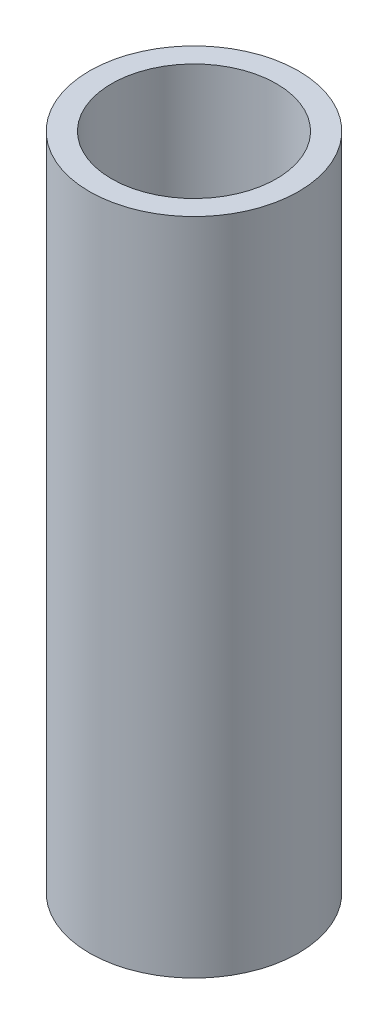
ISO-10303-21;
HEADER;
FILE_DESCRIPTION(('STEP AP214'),'2;1');
FILE_NAME('part.step','',(''),(''),'','','');
FILE_SCHEMA(('AUTOMOTIVE_DESIGN { 1 0 10303 214 1 1 1 1 }'));
ENDSEC;
DATA;
#1=APPLICATION_CONTEXT('core data for automotive mechanical design processes');
#2=APPLICATION_PROTOCOL_DEFINITION('international standard','automotive_design',2000,#1);
#3=PRODUCT_CONTEXT('',#1,'mechanical');
#4=PRODUCT('Part','Part','',(#3));
#5=PRODUCT_RELATED_PRODUCT_CATEGORY('part','',(#4));
#6=PRODUCT_DEFINITION_FORMATION('','',#4);
#7=PRODUCT_DEFINITION_CONTEXT('part definition',#1,'design');
#8=PRODUCT_DEFINITION('design','',#6,#7);
#9=PRODUCT_DEFINITION_SHAPE('','',#8);
#10=(LENGTH_UNIT() NAMED_UNIT(*) SI_UNIT(.MILLI.,.METRE.));
#11=(NAMED_UNIT(*) PLANE_ANGLE_UNIT() SI_UNIT($,.RADIAN.));
#12=(NAMED_UNIT(*) SI_UNIT($,.STERADIAN.) SOLID_ANGLE_UNIT());
#13=UNCERTAINTY_MEASURE_WITH_UNIT(LENGTH_MEASURE(1.E-05),#10,'distance_accuracy_value','');
#14=(GEOMETRIC_REPRESENTATION_CONTEXT(3) GLOBAL_UNCERTAINTY_ASSIGNED_CONTEXT((#13)) GLOBAL_UNIT_ASSIGNED_CONTEXT((#10,
#11,#12)) REPRESENTATION_CONTEXT('',''));
#15=CARTESIAN_POINT('',(0.,0.,0.));
#16=DIRECTION('',(0.,0.,1.));
#17=DIRECTION('',(1.,0.,0.));
#18=AXIS2_PLACEMENT_3D('',#15,#16,#17);
#19=CARTESIAN_POINT('',(-19.05,0.,0.));
#20=DIRECTION('',(0.,1.,0.));
#21=DIRECTION('',(0.,0.,1.));
#22=AXIS2_PLACEMENT_3D('',#19,#20,#21);
#23=PLANE('',#22);
#24=CARTESIAN_POINT('',(0.,0.,0.));
#25=DIRECTION('',(0.,1.,0.));
#26=DIRECTION('',(0.,0.,1.));
#27=AXIS2_PLACEMENT_3D('',#24,#25,#26);
#28=CIRCLE('',#27,24.1554);
#29=CARTESIAN_POINT('',(0.,0.,24.1554));
#30=VERTEX_POINT('',#29);
#31=EDGE_CURVE('E10',#30,#30,#28,.T.);
#32=ORIENTED_EDGE('',*,*,#31,.T.);
#33=EDGE_LOOP('',(#32));
#34=FACE_BOUND('',#33,.T.);
#35=CARTESIAN_POINT('',(0.,0.,0.));
#36=DIRECTION('',(0.,1.,0.));
#37=DIRECTION('',(0.,0.,1.));
#38=AXIS2_PLACEMENT_3D('',#35,#36,#37);
#39=CIRCLE('',#38,19.05);
#40=CARTESIAN_POINT('',(0.,0.,19.05));
#41=VERTEX_POINT('',#40);
#42=EDGE_CURVE('E64',#41,#41,#39,.T.);
#43=ORIENTED_EDGE('',*,*,#42,.F.);
#44=EDGE_LOOP('',(#43));
#45=FACE_BOUND('',#44,.T.);
#46=ADVANCED_FACE('F37',(#34,#45),#23,.T.);
#47=CARTESIAN_POINT('',(0.,0.,0.));
#48=DIRECTION('',(0.,1.,0.));
#49=DIRECTION('',(0.,0.,1.));
#50=AXIS2_PLACEMENT_3D('',#47,#48,#49);
#51=CYLINDRICAL_SURFACE('',#50,24.1554);
#52=CARTESIAN_POINT('',(0.,-152.4,0.));
#53=DIRECTION('',(0.,1.,0.));
#54=DIRECTION('',(0.,0.,1.));
#55=AXIS2_PLACEMENT_3D('',#52,#53,#54);
#56=CIRCLE('',#55,24.1554);
#57=CARTESIAN_POINT('',(0.,-152.4,24.1554));
#58=VERTEX_POINT('',#57);
#59=EDGE_CURVE('E44',#58,#58,#56,.T.);
#60=ORIENTED_EDGE('',*,*,#59,.T.);
#61=EDGE_LOOP('',(#60));
#62=FACE_BOUND('',#61,.T.);
#63=ORIENTED_EDGE('',*,*,#31,.F.);
#64=EDGE_LOOP('',(#63));
#65=FACE_BOUND('',#64,.T.);
#66=ADVANCED_FACE('F73',(#62,#65),#51,.T.);
#67=CARTESIAN_POINT('',(-12.7,-152.4,0.));
#68=DIRECTION('',(0.,-1.,0.));
#69=DIRECTION('',(0.,0.,-1.));
#70=AXIS2_PLACEMENT_3D('',#67,#68,#69);
#71=PLANE('',#70);
#72=CARTESIAN_POINT('',(0.,-152.4,0.));
#73=DIRECTION('',(0.,1.,0.));
#74=DIRECTION('',(0.,0.,1.));
#75=AXIS2_PLACEMENT_3D('',#72,#73,#74);
#76=CIRCLE('',#75,12.7);
#77=CARTESIAN_POINT('',(0.,-152.4,12.7));
#78=VERTEX_POINT('',#77);
#79=EDGE_CURVE('E49',#78,#78,#76,.T.);
#80=ORIENTED_EDGE('',*,*,#79,.T.);
#81=EDGE_LOOP('',(#80));
#82=FACE_BOUND('',#81,.T.);
#83=ORIENTED_EDGE('',*,*,#59,.F.);
#84=EDGE_LOOP('',(#83));
#85=FACE_BOUND('',#84,.T.);
#86=ADVANCED_FACE('F77',(#82,#85),#71,.T.);
#87=CARTESIAN_POINT('',(0.,-152.4,0.));
#88=DIRECTION('',(0.,-1.,0.));
#89=DIRECTION('',(0.,0.,-1.));
#90=AXIS2_PLACEMENT_3D('',#87,#88,#89);
#91=CONICAL_SURFACE('',#90,12.7,0.26179938779915);
#92=CARTESIAN_POINT('',(0.,-128.701477371938,0.));
#93=DIRECTION('',(0.,1.,0.));
#94=DIRECTION('',(0.,0.,1.));
#95=AXIS2_PLACEMENT_3D('',#92,#93,#94);
#96=CIRCLE('',#95,6.34999999999998);
#97=CARTESIAN_POINT('',(0.,-128.701477371938,6.34999999999997));
#98=VERTEX_POINT('',#97);
#99=EDGE_CURVE('E54',#98,#98,#96,.T.);
#100=ORIENTED_EDGE('',*,*,#99,.T.);
#101=EDGE_LOOP('',(#100));
#102=FACE_BOUND('',#101,.T.);
#103=ORIENTED_EDGE('',*,*,#79,.F.);
#104=EDGE_LOOP('',(#103));
#105=FACE_BOUND('',#104,.T.);
#106=ADVANCED_FACE('F81',(#102,#105),#91,.F.);
#107=CARTESIAN_POINT('',(0.,-128.701477371938,0.));
#108=DIRECTION('',(0.,1.,0.));
#109=DIRECTION('',(0.,0.,1.));
#110=AXIS2_PLACEMENT_3D('',#107,#108,#109);
#111=CONICAL_SURFACE('',#110,6.34999999999998,0.785398163397455);
#112=CARTESIAN_POINT('',(0.,-116.001477371938,0.));
#113=DIRECTION('',(0.,1.,0.));
#114=DIRECTION('',(0.,0.,1.));
#115=AXIS2_PLACEMENT_3D('',#112,#113,#114);
#116=CIRCLE('',#115,19.05);
#117=CARTESIAN_POINT('',(0.,-116.001477371938,19.05));
#118=VERTEX_POINT('',#117);
#119=EDGE_CURVE('E60',#118,#118,#116,.T.);
#120=CARTESIAN_POINT('',(0.,-116.001477371938,19.05));
#121=CARTESIAN_POINT('',(0.,-116.133769038605,18.9177083333333));
#122=CARTESIAN_POINT('',(0.,-116.266060705271,18.7854166666666));
#123=CARTESIAN_POINT('',(0.,-116.530644038605,18.5208333333333));
#124=CARTESIAN_POINT('',(0.,-116.662935705271,18.3885416666666));
#125=CARTESIAN_POINT('',(0.,-116.927519038605,18.1239583333333));
#126=CARTESIAN_POINT('',(0.,-117.059810705271,17.9916666666666));
#127=CARTESIAN_POINT('',(0.,-117.324394038605,17.7270833333333));
#128=CARTESIAN_POINT('',(0.,-117.456685705271,17.5947916666666));
#129=CARTESIAN_POINT('',(0.,-117.721269038605,17.3302083333333));
#130=CARTESIAN_POINT('',(0.,-117.853560705271,17.1979166666666));
#131=CARTESIAN_POINT('',(0.,-118.118144038604,16.9333333333333));
#132=CARTESIAN_POINT('',(0.,-118.250435705271,16.8010416666666));
#133=CARTESIAN_POINT('',(0.,-118.515019038604,16.5364583333333));
#134=CARTESIAN_POINT('',(0.,-118.647310705271,16.4041666666666));
#135=CARTESIAN_POINT('',(0.,-118.911894038605,16.1395833333333));
#136=CARTESIAN_POINT('',(0.,-119.044185705271,16.0072916666666));
#137=CARTESIAN_POINT('',(0.,-119.308769038604,15.7427083333333));
#138=CARTESIAN_POINT('',(0.,-119.441060705271,15.6104166666666));
#139=CARTESIAN_POINT('',(0.,-119.705644038604,15.3458333333333));
#140=CARTESIAN_POINT('',(0.,-119.837935705271,15.2135416666666));
#141=CARTESIAN_POINT('',(0.,-120.102519038604,14.9489583333333));
#142=CARTESIAN_POINT('',(0.,-120.234810705271,14.8166666666666));
#143=CARTESIAN_POINT('',(0.,-120.499394038604,14.5520833333333));
#144=CARTESIAN_POINT('',(0.,-120.631685705271,14.4197916666666));
#145=CARTESIAN_POINT('',(0.,-120.896269038604,14.1552083333333));
#146=CARTESIAN_POINT('',(0.,-121.028560705271,14.0229166666666));
#147=CARTESIAN_POINT('',(0.,-121.293144038604,13.7583333333333));
#148=CARTESIAN_POINT('',(0.,-121.425435705271,13.6260416666666));
#149=CARTESIAN_POINT('',(0.,-121.690019038604,13.3614583333333));
#150=CARTESIAN_POINT('',(0.,-121.822310705271,13.2291666666666));
#151=CARTESIAN_POINT('',(0.,-122.086894038604,12.9645833333333));
#152=CARTESIAN_POINT('',(0.,-122.219185705271,12.8322916666666));
#153=CARTESIAN_POINT('',(0.,-122.483769038604,12.5677083333333));
#154=CARTESIAN_POINT('',(0.,-122.616060705271,12.4354166666666));
#155=CARTESIAN_POINT('',(0.,-122.880644038604,12.1708333333333));
#156=CARTESIAN_POINT('',(0.,-123.012935705271,12.0385416666666));
#157=CARTESIAN_POINT('',(0.,-123.277519038604,11.7739583333333));
#158=CARTESIAN_POINT('',(0.,-123.409810705271,11.6416666666666));
#159=CARTESIAN_POINT('',(0.,-123.674394038604,11.3770833333333));
#160=CARTESIAN_POINT('',(0.,-123.806685705271,11.2447916666666));
#161=CARTESIAN_POINT('',(0.,-124.071269038604,10.9802083333333));
#162=CARTESIAN_POINT('',(0.,-124.203560705271,10.8479166666666));
#163=CARTESIAN_POINT('',(0.,-124.468144038604,10.5833333333333));
#164=CARTESIAN_POINT('',(0.,-124.600435705271,10.4510416666666));
#165=CARTESIAN_POINT('',(0.,-124.865019038604,10.1864583333333));
#166=CARTESIAN_POINT('',(0.,-124.997310705271,10.0541666666666));
#167=CARTESIAN_POINT('',(0.,-125.261894038604,9.7895833333333));
#168=CARTESIAN_POINT('',(0.,-125.394185705271,9.65729166666664));
#169=CARTESIAN_POINT('',(0.,-125.658769038604,9.3927083333333));
#170=CARTESIAN_POINT('',(0.,-125.791060705271,9.26041666666664));
#171=CARTESIAN_POINT('',(0.,-126.055644038604,8.99583333333331));
#172=CARTESIAN_POINT('',(0.,-126.187935705271,8.86354166666664));
#173=CARTESIAN_POINT('',(0.,-126.452519038604,8.5989583333333));
#174=CARTESIAN_POINT('',(0.,-126.584810705271,8.46666666666664));
#175=CARTESIAN_POINT('',(0.,-126.849394038604,8.20208333333331));
#176=CARTESIAN_POINT('',(0.,-126.981685705271,8.06979166666664));
#177=CARTESIAN_POINT('',(0.,-127.246269038604,7.8052083333333));
#178=CARTESIAN_POINT('',(0.,-127.378560705271,7.67291666666664));
#179=CARTESIAN_POINT('',(0.,-127.643144038604,7.4083333333333));
#180=CARTESIAN_POINT('',(0.,-127.775435705271,7.27604166666664));
#181=CARTESIAN_POINT('',(0.,-128.040019038604,7.0114583333333));
#182=CARTESIAN_POINT('',(0.,-128.172310705271,6.87916666666664));
#183=CARTESIAN_POINT('',(0.,-128.436894038604,6.6145833333333));
#184=CARTESIAN_POINT('',(0.,-128.569185705271,6.48229166666663));
#185=CARTESIAN_POINT('',(0.,-128.701477371938,6.34999999999997));
#186=B_SPLINE_CURVE_WITH_KNOTS('',3,(#120,#121,#122,#123,#124,#125,#126,#127,#128,#129,#130,
#131,#132,#133,#134,#135,#136,#137,#138,#139,#140,#141,#142,#143,#144,#145,#146,#147,#148,#149,
#150,#151,#152,#153,#154,#155,#156,#157,#158,#159,#160,#161,#162,#163,#164,#165,#166,#167,#168,
#169,#170,#171,#172,#173,#174,#175,#176,#177,#178,#179,#180,#181,#182,#183,#184,#185),
.UNSPECIFIED.,.F.,.F.,(4,2,2,2,2,2,2,2,2,2,2,2,2,2,2,2,2,2,2,2,2,2,2,2,2,2,2,2,2,2,2,2,4),(0.,
0.561266007566827,1.12253201513364,1.68379802270046,2.24506403026728,2.8063300378341,
3.36759604540092,3.92886205296773,4.49012806053456,5.05139406810137,5.61266007566819,
6.17392608323502,6.73519209080183,7.29645809836865,7.85772410593546,8.41899011350228,
8.98025612106911,9.54152212863592,10.1027881362027,10.6640541437696,11.2253201513364,
11.7865861589032,12.34785216647,12.9091181740368,13.4703841816036,14.0316501891705,
14.5929161967373,15.1541822043041,15.7154482118709,16.2767142194377,16.8379802270046,
17.3992462345714,17.9605122421382),.UNSPECIFIED.);
#187=EDGE_CURVE('BSEAM88',#118,#98,#186,.T.);
#188=ORIENTED_EDGE('',*,*,#119,.T.);
#189=ORIENTED_EDGE('',*,*,#99,.F.);
#190=ORIENTED_EDGE('',*,*,#187,.T.);
#191=ORIENTED_EDGE('',*,*,#187,.F.);
#192=EDGE_LOOP('',(#188,#190,#189,#191));
#193=FACE_BOUND('',#192,.T.);
#194=ADVANCED_FACE('F88',(#193),#111,.F.);
#195=CARTESIAN_POINT('',(0.,0.,0.));
#196=DIRECTION('',(0.,1.,0.));
#197=DIRECTION('',(0.,0.,1.));
#198=AXIS2_PLACEMENT_3D('',#195,#196,#197);
#199=CYLINDRICAL_SURFACE('',#198,19.05);
#200=ORIENTED_EDGE('',*,*,#42,.T.);
#201=EDGE_LOOP('',(#200));
#202=FACE_BOUND('',#201,.T.);
#203=ORIENTED_EDGE('',*,*,#119,.F.);
#204=EDGE_LOOP('',(#203));
#205=FACE_BOUND('',#204,.T.);
#206=ADVANCED_FACE('F69',(#202,#205),#199,.F.);
#207=CLOSED_SHELL('',(#46,#66,#86,#106,#194,#206));
#208=MANIFOLD_SOLID_BREP('B2',#207);
#209=ADVANCED_BREP_SHAPE_REPRESENTATION('',(#18,#208),#14);
#210=SHAPE_DEFINITION_REPRESENTATION(#9,#209);
ENDSEC;
END-ISO-10303-21;
